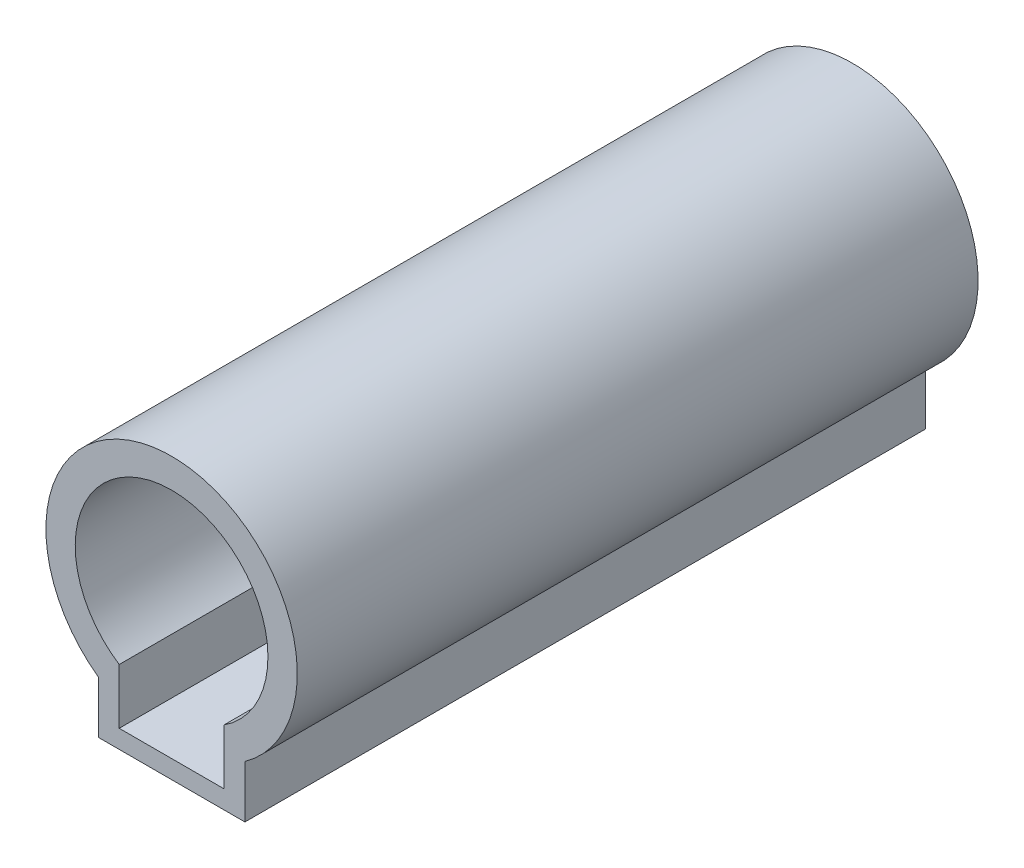
ISO-10303-21;
HEADER;
FILE_DESCRIPTION(('STEP AP214'),'2;1');
FILE_NAME('part.step','',(''),(''),'','','');
FILE_SCHEMA(('AUTOMOTIVE_DESIGN { 1 0 10303 214 1 1 1 1 }'));
ENDSEC;
DATA;
#1=APPLICATION_CONTEXT('core data for automotive mechanical design processes');
#2=APPLICATION_PROTOCOL_DEFINITION('international standard','automotive_design',2000,#1);
#3=PRODUCT_CONTEXT('',#1,'mechanical');
#4=PRODUCT('Part','Part','',(#3));
#5=PRODUCT_RELATED_PRODUCT_CATEGORY('part','',(#4));
#6=PRODUCT_DEFINITION_FORMATION('','',#4);
#7=PRODUCT_DEFINITION_CONTEXT('part definition',#1,'design');
#8=PRODUCT_DEFINITION('design','',#6,#7);
#9=PRODUCT_DEFINITION_SHAPE('','',#8);
#10=(LENGTH_UNIT() NAMED_UNIT(*) SI_UNIT(.MILLI.,.METRE.));
#11=(NAMED_UNIT(*) PLANE_ANGLE_UNIT() SI_UNIT($,.RADIAN.));
#12=(NAMED_UNIT(*) SI_UNIT($,.STERADIAN.) SOLID_ANGLE_UNIT());
#13=UNCERTAINTY_MEASURE_WITH_UNIT(LENGTH_MEASURE(1.E-05),#10,'distance_accuracy_value','');
#14=(GEOMETRIC_REPRESENTATION_CONTEXT(3) GLOBAL_UNCERTAINTY_ASSIGNED_CONTEXT((#13)) GLOBAL_UNIT_ASSIGNED_CONTEXT((#10,
#11,#12)) REPRESENTATION_CONTEXT('',''));
#15=CARTESIAN_POINT('',(0.,0.,0.));
#16=DIRECTION('',(0.,0.,1.));
#17=DIRECTION('',(1.,0.,0.));
#18=AXIS2_PLACEMENT_3D('',#15,#16,#17);
#19=CARTESIAN_POINT('',(0.,0.,65.));
#20=DIRECTION('',(0.,0.,-1.));
#21=DIRECTION('',(-1.,0.,0.));
#22=AXIS2_PLACEMENT_3D('',#19,#20,#21);
#23=CYLINDRICAL_SURFACE('',#22,9.2);
#24=CARTESIAN_POINT('',(0.,0.,65.));
#25=DIRECTION('',(0.,0.,1.));
#26=DIRECTION('',(1.,0.,0.));
#27=AXIS2_PLACEMENT_3D('',#24,#25,#26);
#28=CIRCLE('',#27,9.2);
#29=CARTESIAN_POINT('',(5.,-7.72269383052313,65.));
#30=VERTEX_POINT('',#29);
#31=CARTESIAN_POINT('',(-5.,-7.72269383052313,65.));
#32=VERTEX_POINT('',#31);
#33=EDGE_CURVE('E140',#30,#32,#28,.T.);
#34=ORIENTED_EDGE('',*,*,#33,.T.);
#35=DIRECTION('',(0.,0.,-1.));
#36=VECTOR('',#35,1.);
#37=CARTESIAN_POINT('',(-5.,-7.72269383052313,65.));
#38=LINE('',#37,#36);
#39=CARTESIAN_POINT('',(-5.,-7.72269383052313,0.));
#40=VERTEX_POINT('',#39);
#41=EDGE_CURVE('E113',#32,#40,#38,.T.);
#42=ORIENTED_EDGE('',*,*,#41,.T.);
#43=CARTESIAN_POINT('',(0.,0.,0.));
#44=DIRECTION('',(0.,0.,1.));
#45=DIRECTION('',(1.,0.,0.));
#46=AXIS2_PLACEMENT_3D('',#43,#44,#45);
#47=CIRCLE('',#46,9.2);
#48=CARTESIAN_POINT('',(5.,-7.72269383052313,0.));
#49=VERTEX_POINT('',#48);
#50=EDGE_CURVE('E139',#49,#40,#47,.T.);
#51=ORIENTED_EDGE('',*,*,#50,.F.);
#52=DIRECTION('',(0.,0.,-1.));
#53=VECTOR('',#52,1.);
#54=CARTESIAN_POINT('',(5.,-7.72269383052313,65.));
#55=LINE('',#54,#53);
#56=EDGE_CURVE('E48',#49,#30,#55,.F.);
#57=ORIENTED_EDGE('',*,*,#56,.T.);
#58=EDGE_LOOP('',(#34,#42,#51,#57));
#59=FACE_BOUND('',#58,.T.);
#60=ADVANCED_FACE('F34',(#59),#23,.F.);
#61=CARTESIAN_POINT('',(0.,0.,65.));
#62=DIRECTION('',(0.,0.,1.));
#63=DIRECTION('',(1.,0.,0.));
#64=AXIS2_PLACEMENT_3D('',#61,#62,#63);
#65=PLANE('',#64);
#66=CARTESIAN_POINT('',(0.,0.,65.));
#67=DIRECTION('',(0.,0.,1.));
#68=DIRECTION('',(1.,0.,0.));
#69=AXIS2_PLACEMENT_3D('',#66,#67,#68);
#70=CIRCLE('',#69,12.);
#71=CARTESIAN_POINT('',(7.,-9.74679434480896,65.));
#72=VERTEX_POINT('',#71);
#73=CARTESIAN_POINT('',(-7.,-9.74679434480896,65.));
#74=VERTEX_POINT('',#73);
#75=EDGE_CURVE('E83',#72,#74,#70,.T.);
#76=ORIENTED_EDGE('',*,*,#75,.T.);
#77=DIRECTION('',(0.,1.,0.));
#78=VECTOR('',#77,1.);
#79=CARTESIAN_POINT('',(-7.,0.,65.));
#80=LINE('',#79,#78);
#81=CARTESIAN_POINT('',(-7.,-14.746794344809,65.));
#82=VERTEX_POINT('',#81);
#83=EDGE_CURVE('E143',#82,#74,#80,.T.);
#84=ORIENTED_EDGE('',*,*,#83,.F.);
#85=DIRECTION('',(1.,0.,0.));
#86=VECTOR('',#85,1.);
#87=CARTESIAN_POINT('',(0.,-14.746794344809,65.));
#88=LINE('',#87,#86);
#89=CARTESIAN_POINT('',(7.,-14.746794344809,65.));
#90=VERTEX_POINT('',#89);
#91=EDGE_CURVE('E146',#82,#90,#88,.T.);
#92=ORIENTED_EDGE('',*,*,#91,.T.);
#93=DIRECTION('',(0.,1.,0.));
#94=VECTOR('',#93,1.);
#95=CARTESIAN_POINT('',(7.00000000000001,0.,65.));
#96=LINE('',#95,#94);
#97=EDGE_CURVE('E57',#90,#72,#96,.T.);
#98=ORIENTED_EDGE('',*,*,#97,.T.);
#99=EDGE_LOOP('',(#76,#84,#92,#98));
#100=FACE_BOUND('',#99,.T.);
#101=DIRECTION('',(1.,0.,0.));
#102=VECTOR('',#101,1.);
#103=CARTESIAN_POINT('',(5.,-13.,65.));
#104=LINE('',#103,#102);
#105=CARTESIAN_POINT('',(-5.,-13.,65.));
#106=VERTEX_POINT('',#105);
#107=CARTESIAN_POINT('',(5.,-13.,65.));
#108=VERTEX_POINT('',#107);
#109=EDGE_CURVE('E118',#106,#108,#104,.T.);
#110=ORIENTED_EDGE('',*,*,#109,.F.);
#111=DIRECTION('',(0.,-1.,0.));
#112=VECTOR('',#111,1.);
#113=CARTESIAN_POINT('',(-5.,-0.601583750938876,65.));
#114=LINE('',#113,#112);
#115=EDGE_CURVE('E107',#32,#106,#114,.T.);
#116=ORIENTED_EDGE('',*,*,#115,.F.);
#117=ORIENTED_EDGE('',*,*,#33,.F.);
#118=DIRECTION('',(0.,1.,0.));
#119=VECTOR('',#118,1.);
#120=CARTESIAN_POINT('',(5.,-0.601583750938875,65.));
#121=LINE('',#120,#119);
#122=EDGE_CURVE('E130',#108,#30,#121,.T.);
#123=ORIENTED_EDGE('',*,*,#122,.F.);
#124=EDGE_LOOP('',(#110,#116,#117,#123));
#125=FACE_BOUND('',#124,.T.);
#126=ADVANCED_FACE('F129',(#100,#125),#65,.T.);
#127=CARTESIAN_POINT('',(0.,0.,0.));
#128=DIRECTION('',(0.,0.,1.));
#129=DIRECTION('',(1.,0.,0.));
#130=AXIS2_PLACEMENT_3D('',#127,#128,#129);
#131=PLANE('',#130);
#132=CARTESIAN_POINT('',(0.,0.,0.));
#133=DIRECTION('',(0.,0.,1.));
#134=DIRECTION('',(1.,0.,0.));
#135=AXIS2_PLACEMENT_3D('',#132,#133,#134);
#136=CIRCLE('',#135,12.);
#137=CARTESIAN_POINT('',(7.,-9.74679434480896,0.));
#138=VERTEX_POINT('',#137);
#139=CARTESIAN_POINT('',(-7.,-9.74679434480896,0.));
#140=VERTEX_POINT('',#139);
#141=EDGE_CURVE('E152',#138,#140,#136,.T.);
#142=ORIENTED_EDGE('',*,*,#141,.F.);
#143=DIRECTION('',(0.,1.,0.));
#144=VECTOR('',#143,1.);
#145=CARTESIAN_POINT('',(7.00000000000001,0.,0.));
#146=LINE('',#145,#144);
#147=CARTESIAN_POINT('',(7.,-14.746794344809,0.));
#148=VERTEX_POINT('',#147);
#149=EDGE_CURVE('E78',#148,#138,#146,.T.);
#150=ORIENTED_EDGE('',*,*,#149,.F.);
#151=DIRECTION('',(1.,0.,0.));
#152=VECTOR('',#151,1.);
#153=CARTESIAN_POINT('',(0.,-14.746794344809,0.));
#154=LINE('',#153,#152);
#155=CARTESIAN_POINT('',(-7.,-14.746794344809,0.));
#156=VERTEX_POINT('',#155);
#157=EDGE_CURVE('E158',#156,#148,#154,.T.);
#158=ORIENTED_EDGE('',*,*,#157,.F.);
#159=DIRECTION('',(0.,1.,0.));
#160=VECTOR('',#159,1.);
#161=CARTESIAN_POINT('',(-7.,0.,0.));
#162=LINE('',#161,#160);
#163=EDGE_CURVE('E155',#156,#140,#162,.T.);
#164=ORIENTED_EDGE('',*,*,#163,.T.);
#165=EDGE_LOOP('',(#142,#150,#158,#164));
#166=FACE_BOUND('',#165,.T.);
#167=DIRECTION('',(0.,1.,0.));
#168=VECTOR('',#167,1.);
#169=CARTESIAN_POINT('',(-5.,0.,0.));
#170=LINE('',#169,#168);
#171=CARTESIAN_POINT('',(-5.,-13.,0.));
#172=VERTEX_POINT('',#171);
#173=EDGE_CURVE('E11',#172,#40,#170,.T.);
#174=ORIENTED_EDGE('',*,*,#173,.F.);
#175=DIRECTION('',(1.,0.,0.));
#176=VECTOR('',#175,1.);
#177=CARTESIAN_POINT('',(5.,-13.,0.));
#178=LINE('',#177,#176);
#179=CARTESIAN_POINT('',(5.,-13.,0.));
#180=VERTEX_POINT('',#179);
#181=EDGE_CURVE('E125',#172,#180,#178,.T.);
#182=ORIENTED_EDGE('',*,*,#181,.T.);
#183=DIRECTION('',(0.,1.,0.));
#184=VECTOR('',#183,1.);
#185=CARTESIAN_POINT('',(5.,-0.601583750938875,0.));
#186=LINE('',#185,#184);
#187=EDGE_CURVE('E119',#180,#49,#186,.T.);
#188=ORIENTED_EDGE('',*,*,#187,.T.);
#189=ORIENTED_EDGE('',*,*,#50,.T.);
#190=EDGE_LOOP('',(#174,#182,#188,#189));
#191=FACE_BOUND('',#190,.T.);
#192=ADVANCED_FACE('F173',(#166,#191),#131,.F.);
#193=CARTESIAN_POINT('',(0.,0.,65.));
#194=DIRECTION('',(0.,0.,-1.));
#195=DIRECTION('',(-1.,0.,0.));
#196=AXIS2_PLACEMENT_3D('',#193,#194,#195);
#197=CYLINDRICAL_SURFACE('',#196,12.);
#198=ORIENTED_EDGE('',*,*,#141,.T.);
#199=DIRECTION('',(0.,0.,-1.));
#200=VECTOR('',#199,1.);
#201=CARTESIAN_POINT('',(-7.,-9.74679434480896,65.));
#202=LINE('',#201,#200);
#203=EDGE_CURVE('E41',#74,#140,#202,.T.);
#204=ORIENTED_EDGE('',*,*,#203,.F.);
#205=ORIENTED_EDGE('',*,*,#75,.F.);
#206=DIRECTION('',(0.,0.,-1.));
#207=VECTOR('',#206,1.);
#208=CARTESIAN_POINT('',(7.,-9.74679434480896,65.));
#209=LINE('',#208,#207);
#210=EDGE_CURVE('E149',#72,#138,#209,.T.);
#211=ORIENTED_EDGE('',*,*,#210,.T.);
#212=EDGE_LOOP('',(#198,#204,#205,#211));
#213=FACE_BOUND('',#212,.T.);
#214=ADVANCED_FACE('F170',(#213),#197,.T.);
#215=CARTESIAN_POINT('',(-7.,0.,65.));
#216=DIRECTION('',(-1.,0.,0.));
#217=DIRECTION('',(0.,-1.,0.));
#218=AXIS2_PLACEMENT_3D('',#215,#216,#217);
#219=PLANE('',#218);
#220=ORIENTED_EDGE('',*,*,#163,.F.);
#221=DIRECTION('',(0.,0.,-1.));
#222=VECTOR('',#221,1.);
#223=CARTESIAN_POINT('',(-7.,-14.746794344809,65.));
#224=LINE('',#223,#222);
#225=EDGE_CURVE('E164',#82,#156,#224,.T.);
#226=ORIENTED_EDGE('',*,*,#225,.F.);
#227=ORIENTED_EDGE('',*,*,#83,.T.);
#228=ORIENTED_EDGE('',*,*,#203,.T.);
#229=EDGE_LOOP('',(#220,#226,#227,#228));
#230=FACE_BOUND('',#229,.T.);
#231=ADVANCED_FACE('F167',(#230),#219,.T.);
#232=CARTESIAN_POINT('',(0.,-14.746794344809,65.));
#233=DIRECTION('',(0.,1.,0.));
#234=DIRECTION('',(0.,0.,1.));
#235=AXIS2_PLACEMENT_3D('',#232,#233,#234);
#236=PLANE('',#235);
#237=ORIENTED_EDGE('',*,*,#157,.T.);
#238=DIRECTION('',(0.,0.,-1.));
#239=VECTOR('',#238,1.);
#240=CARTESIAN_POINT('',(7.,-14.746794344809,65.));
#241=LINE('',#240,#239);
#242=EDGE_CURVE('E162',#90,#148,#241,.T.);
#243=ORIENTED_EDGE('',*,*,#242,.F.);
#244=ORIENTED_EDGE('',*,*,#91,.F.);
#245=ORIENTED_EDGE('',*,*,#225,.T.);
#246=EDGE_LOOP('',(#237,#243,#244,#245));
#247=FACE_BOUND('',#246,.T.);
#248=ADVANCED_FACE('F177',(#247),#236,.F.);
#249=CARTESIAN_POINT('',(7.00000000000001,0.,65.));
#250=DIRECTION('',(-1.,0.,0.));
#251=DIRECTION('',(0.,-1.,0.));
#252=AXIS2_PLACEMENT_3D('',#249,#250,#251);
#253=PLANE('',#252);
#254=ORIENTED_EDGE('',*,*,#149,.T.);
#255=ORIENTED_EDGE('',*,*,#210,.F.);
#256=ORIENTED_EDGE('',*,*,#97,.F.);
#257=ORIENTED_EDGE('',*,*,#242,.T.);
#258=EDGE_LOOP('',(#254,#255,#256,#257));
#259=FACE_BOUND('',#258,.T.);
#260=ADVANCED_FACE('F179',(#259),#253,.F.);
#261=CARTESIAN_POINT('',(-5.,-0.601583750938876,65.));
#262=DIRECTION('',(1.,0.,0.));
#263=DIRECTION('',(0.,1.,0.));
#264=AXIS2_PLACEMENT_3D('',#261,#262,#263);
#265=PLANE('',#264);
#266=ORIENTED_EDGE('',*,*,#115,.T.);
#267=DIRECTION('',(0.,0.,-1.));
#268=VECTOR('',#267,1.);
#269=CARTESIAN_POINT('',(-5.,-13.,65.));
#270=LINE('',#269,#268);
#271=EDGE_CURVE('E110',#106,#172,#270,.T.);
#272=ORIENTED_EDGE('',*,*,#271,.T.);
#273=ORIENTED_EDGE('',*,*,#173,.T.);
#274=ORIENTED_EDGE('',*,*,#41,.F.);
#275=EDGE_LOOP('',(#266,#272,#273,#274));
#276=FACE_BOUND('',#275,.T.);
#277=ADVANCED_FACE('F109',(#276),#265,.T.);
#278=CARTESIAN_POINT('',(5.,-13.,65.));
#279=DIRECTION('',(0.,1.,0.));
#280=DIRECTION('',(-1.,0.,0.));
#281=AXIS2_PLACEMENT_3D('',#278,#279,#280);
#282=PLANE('',#281);
#283=ORIENTED_EDGE('',*,*,#181,.F.);
#284=ORIENTED_EDGE('',*,*,#271,.F.);
#285=ORIENTED_EDGE('',*,*,#109,.T.);
#286=DIRECTION('',(0.,0.,-1.));
#287=VECTOR('',#286,1.);
#288=CARTESIAN_POINT('',(5.,-13.,65.));
#289=LINE('',#288,#287);
#290=EDGE_CURVE('E126',#108,#180,#289,.T.);
#291=ORIENTED_EDGE('',*,*,#290,.T.);
#292=EDGE_LOOP('',(#283,#284,#285,#291));
#293=FACE_BOUND('',#292,.T.);
#294=ADVANCED_FACE('F122',(#293),#282,.T.);
#295=CARTESIAN_POINT('',(5.,-0.601583750938875,65.));
#296=DIRECTION('',(-1.,0.,0.));
#297=DIRECTION('',(0.,-1.,0.));
#298=AXIS2_PLACEMENT_3D('',#295,#296,#297);
#299=PLANE('',#298);
#300=ORIENTED_EDGE('',*,*,#187,.F.);
#301=ORIENTED_EDGE('',*,*,#290,.F.);
#302=ORIENTED_EDGE('',*,*,#122,.T.);
#303=ORIENTED_EDGE('',*,*,#56,.F.);
#304=EDGE_LOOP('',(#300,#301,#302,#303));
#305=FACE_BOUND('',#304,.T.);
#306=ADVANCED_FACE('F196',(#305),#299,.T.);
#307=CLOSED_SHELL('',(#60,#126,#192,#214,#231,#248,#260,#277,#294,#306));
#308=MANIFOLD_SOLID_BREP('B2',#307);
#309=ADVANCED_BREP_SHAPE_REPRESENTATION('',(#18,#308),#14);
#310=SHAPE_DEFINITION_REPRESENTATION(#9,#309);
ENDSEC;
END-ISO-10303-21;
